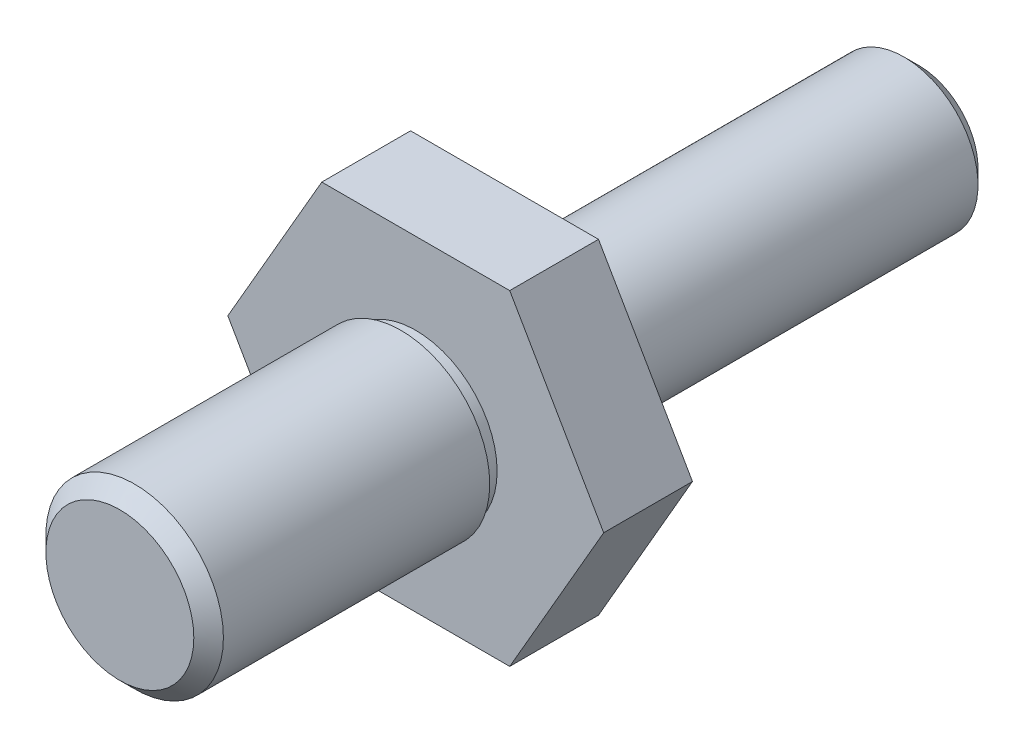
ISO-10303-21;
HEADER;
FILE_DESCRIPTION(('STEP AP214'),'2;1');
FILE_NAME('part.step','',(''),(''),'','','');
FILE_SCHEMA(('AUTOMOTIVE_DESIGN { 1 0 10303 214 1 1 1 1 }'));
ENDSEC;
DATA;
#1=APPLICATION_CONTEXT('core data for automotive mechanical design processes');
#2=APPLICATION_PROTOCOL_DEFINITION('international standard','automotive_design',2000,#1);
#3=PRODUCT_CONTEXT('',#1,'mechanical');
#4=PRODUCT('Part','Part','',(#3));
#5=PRODUCT_RELATED_PRODUCT_CATEGORY('part','',(#4));
#6=PRODUCT_DEFINITION_FORMATION('','',#4);
#7=PRODUCT_DEFINITION_CONTEXT('part definition',#1,'design');
#8=PRODUCT_DEFINITION('design','',#6,#7);
#9=PRODUCT_DEFINITION_SHAPE('','',#8);
#10=(LENGTH_UNIT() NAMED_UNIT(*) SI_UNIT(.MILLI.,.METRE.));
#11=(NAMED_UNIT(*) PLANE_ANGLE_UNIT() SI_UNIT($,.RADIAN.));
#12=(NAMED_UNIT(*) SI_UNIT($,.STERADIAN.) SOLID_ANGLE_UNIT());
#13=UNCERTAINTY_MEASURE_WITH_UNIT(LENGTH_MEASURE(1.E-05),#10,'distance_accuracy_value','');
#14=(GEOMETRIC_REPRESENTATION_CONTEXT(3) GLOBAL_UNCERTAINTY_ASSIGNED_CONTEXT((#13)) GLOBAL_UNIT_ASSIGNED_CONTEXT((#10,
#11,#12)) REPRESENTATION_CONTEXT('',''));
#15=CARTESIAN_POINT('',(0.,0.,0.));
#16=DIRECTION('',(0.,0.,1.));
#17=DIRECTION('',(1.,0.,0.));
#18=AXIS2_PLACEMENT_3D('',#15,#16,#17);
#19=CARTESIAN_POINT('',(0.,0.,-7.5));
#20=DIRECTION('',(0.,0.,-1.));
#21=DIRECTION('',(-1.,0.,0.));
#22=AXIS2_PLACEMENT_3D('',#19,#20,#21);
#23=PLANE('',#22);
#24=CARTESIAN_POINT('',(0.,0.,-7.5));
#25=DIRECTION('',(0.,0.,-1.));
#26=DIRECTION('',(-1.,0.,0.));
#27=AXIS2_PLACEMENT_3D('',#24,#25,#26);
#28=CIRCLE('',#27,7.5);
#29=CARTESIAN_POINT('',(-7.5,0.,-7.5));
#30=VERTEX_POINT('',#29);
#31=EDGE_CURVE('E159',#30,#30,#28,.T.);
#32=ORIENTED_EDGE('',*,*,#31,.T.);
#33=EDGE_LOOP('',(#32));
#34=FACE_BOUND('',#33,.T.);
#35=CARTESIAN_POINT('',(0.,0.,-7.5));
#36=DIRECTION('',(0.,0.,-1.));
#37=DIRECTION('',(-1.,0.,0.));
#38=AXIS2_PLACEMENT_3D('',#35,#36,#37);
#39=CIRCLE('',#38,5.);
#40=CARTESIAN_POINT('',(-5.,0.,-7.5));
#41=VERTEX_POINT('',#40);
#42=EDGE_CURVE('E250',#41,#41,#39,.T.);
#43=ORIENTED_EDGE('',*,*,#42,.F.);
#44=EDGE_LOOP('',(#43));
#45=FACE_BOUND('',#44,.T.);
#46=ADVANCED_FACE('F66',(#34,#45),#23,.T.);
#47=CARTESIAN_POINT('',(-6.35085296108588,11.,-6.));
#48=DIRECTION('',(0.,0.,-1.));
#49=DIRECTION('',(-1.,0.,0.));
#50=AXIS2_PLACEMENT_3D('',#47,#48,#49);
#51=PLANE('',#50);
#52=DIRECTION('',(0.5,0.866025403784438,0.));
#53=VECTOR('',#52,1.);
#54=CARTESIAN_POINT('',(-12.7017059221718,0.,-6.));
#55=LINE('',#54,#53);
#56=CARTESIAN_POINT('',(-12.7017059221718,0.,-6.));
#57=VERTEX_POINT('',#56);
#58=CARTESIAN_POINT('',(-6.35085296108588,11.,-6.));
#59=VERTEX_POINT('',#58);
#60=EDGE_CURVE('E166',#57,#59,#55,.T.);
#61=ORIENTED_EDGE('',*,*,#60,.T.);
#62=DIRECTION('',(1.,0.,0.));
#63=VECTOR('',#62,1.);
#64=CARTESIAN_POINT('',(-6.35085296108588,11.,-6.));
#65=LINE('',#64,#63);
#66=CARTESIAN_POINT('',(6.35085296108588,11.,-6.));
#67=VERTEX_POINT('',#66);
#68=EDGE_CURVE('E122',#59,#67,#65,.T.);
#69=ORIENTED_EDGE('',*,*,#68,.T.);
#70=DIRECTION('',(0.5,-0.866025403784439,0.));
#71=VECTOR('',#70,1.);
#72=CARTESIAN_POINT('',(6.35085296108588,11.,-6.));
#73=LINE('',#72,#71);
#74=CARTESIAN_POINT('',(12.7017059221718,0.,-6.));
#75=VERTEX_POINT('',#74);
#76=EDGE_CURVE('E137',#67,#75,#73,.T.);
#77=ORIENTED_EDGE('',*,*,#76,.T.);
#78=DIRECTION('',(-0.5,-0.866025403784438,0.));
#79=VECTOR('',#78,1.);
#80=CARTESIAN_POINT('',(12.7017059221718,0.,-6.));
#81=LINE('',#80,#79);
#82=CARTESIAN_POINT('',(6.35085296108588,-11.,-6.));
#83=VERTEX_POINT('',#82);
#84=EDGE_CURVE('E130',#75,#83,#81,.T.);
#85=ORIENTED_EDGE('',*,*,#84,.T.);
#86=DIRECTION('',(-1.,0.,0.));
#87=VECTOR('',#86,1.);
#88=CARTESIAN_POINT('',(6.35085296108588,-11.,-6.));
#89=LINE('',#88,#87);
#90=CARTESIAN_POINT('',(-6.35085296108588,-11.,-6.));
#91=VERTEX_POINT('',#90);
#92=EDGE_CURVE('E135',#83,#91,#89,.T.);
#93=ORIENTED_EDGE('',*,*,#92,.T.);
#94=DIRECTION('',(-0.5,0.866025403784438,0.));
#95=VECTOR('',#94,1.);
#96=CARTESIAN_POINT('',(-6.35085296108588,-11.,-6.));
#97=LINE('',#96,#95);
#98=EDGE_CURVE('E83',#91,#57,#97,.T.);
#99=ORIENTED_EDGE('',*,*,#98,.T.);
#100=EDGE_LOOP('',(#61,#69,#77,#85,#93,#99));
#101=FACE_BOUND('',#100,.T.);
#102=CARTESIAN_POINT('',(0.,0.,-6.));
#103=DIRECTION('',(0.,0.,-1.));
#104=DIRECTION('',(-1.,0.,0.));
#105=AXIS2_PLACEMENT_3D('',#102,#103,#104);
#106=CIRCLE('',#105,7.5);
#107=CARTESIAN_POINT('',(-7.5,0.,-6.));
#108=VERTEX_POINT('',#107);
#109=EDGE_CURVE('E254',#108,#108,#106,.T.);
#110=ORIENTED_EDGE('',*,*,#109,.F.);
#111=EDGE_LOOP('',(#110));
#112=FACE_BOUND('',#111,.T.);
#113=ADVANCED_FACE('F132',(#101,#112),#51,.T.);
#114=CARTESIAN_POINT('',(-6.35085296108588,11.,0.));
#115=DIRECTION('',(0.,0.,-1.));
#116=DIRECTION('',(-1.,0.,0.));
#117=AXIS2_PLACEMENT_3D('',#114,#115,#116);
#118=PLANE('',#117);
#119=DIRECTION('',(0.5,0.866025403784438,0.));
#120=VECTOR('',#119,1.);
#121=CARTESIAN_POINT('',(-12.7017059221718,0.,0.));
#122=LINE('',#121,#120);
#123=CARTESIAN_POINT('',(-12.7017059221718,0.,0.));
#124=VERTEX_POINT('',#123);
#125=CARTESIAN_POINT('',(-6.35085296108588,11.,0.));
#126=VERTEX_POINT('',#125);
#127=EDGE_CURVE('E155',#124,#126,#122,.T.);
#128=ORIENTED_EDGE('',*,*,#127,.F.);
#129=DIRECTION('',(-0.5,0.866025403784438,0.));
#130=VECTOR('',#129,1.);
#131=CARTESIAN_POINT('',(-6.35085296108588,-11.,0.));
#132=LINE('',#131,#130);
#133=CARTESIAN_POINT('',(-6.35085296108588,-11.,0.));
#134=VERTEX_POINT('',#133);
#135=EDGE_CURVE('E113',#134,#124,#132,.T.);
#136=ORIENTED_EDGE('',*,*,#135,.F.);
#137=DIRECTION('',(-1.,0.,0.));
#138=VECTOR('',#137,1.);
#139=CARTESIAN_POINT('',(6.35085296108588,-11.,0.));
#140=LINE('',#139,#138);
#141=CARTESIAN_POINT('',(6.35085296108588,-11.,0.));
#142=VERTEX_POINT('',#141);
#143=EDGE_CURVE('E107',#142,#134,#140,.T.);
#144=ORIENTED_EDGE('',*,*,#143,.F.);
#145=DIRECTION('',(-0.5,-0.866025403784438,0.));
#146=VECTOR('',#145,1.);
#147=CARTESIAN_POINT('',(12.7017059221718,0.,0.));
#148=LINE('',#147,#146);
#149=CARTESIAN_POINT('',(12.7017059221718,0.,0.));
#150=VERTEX_POINT('',#149);
#151=EDGE_CURVE('E145',#150,#142,#148,.T.);
#152=ORIENTED_EDGE('',*,*,#151,.F.);
#153=DIRECTION('',(0.5,-0.866025403784439,0.));
#154=VECTOR('',#153,1.);
#155=CARTESIAN_POINT('',(6.35085296108588,11.,0.));
#156=LINE('',#155,#154);
#157=CARTESIAN_POINT('',(6.35085296108588,11.,0.));
#158=VERTEX_POINT('',#157);
#159=EDGE_CURVE('E161',#158,#150,#156,.T.);
#160=ORIENTED_EDGE('',*,*,#159,.F.);
#161=DIRECTION('',(1.,0.,0.));
#162=VECTOR('',#161,1.);
#163=CARTESIAN_POINT('',(-6.35085296108588,11.,0.));
#164=LINE('',#163,#162);
#165=EDGE_CURVE('E158',#126,#158,#164,.T.);
#166=ORIENTED_EDGE('',*,*,#165,.F.);
#167=EDGE_LOOP('',(#128,#136,#144,#152,#160,#166));
#168=FACE_BOUND('',#167,.T.);
#169=CARTESIAN_POINT('',(0.,0.,0.));
#170=DIRECTION('',(0.,0.,1.));
#171=DIRECTION('',(1.,0.,0.));
#172=AXIS2_PLACEMENT_3D('',#169,#170,#171);
#173=CIRCLE('',#172,5.5);
#174=CARTESIAN_POINT('',(5.5,0.,0.));
#175=VERTEX_POINT('',#174);
#176=EDGE_CURVE('E257',#175,#175,#173,.T.);
#177=ORIENTED_EDGE('',*,*,#176,.F.);
#178=EDGE_LOOP('',(#177));
#179=FACE_BOUND('',#178,.T.);
#180=ADVANCED_FACE('F200',(#168,#179),#118,.F.);
#181=CARTESIAN_POINT('',(-12.7017059221718,0.,-6.));
#182=DIRECTION('',(0.866025403784439,-0.5,0.));
#183=DIRECTION('',(0.5,0.866025403784439,0.));
#184=AXIS2_PLACEMENT_3D('',#181,#182,#183);
#185=PLANE('',#184);
#186=ORIENTED_EDGE('',*,*,#127,.T.);
#187=DIRECTION('',(0.,0.,1.));
#188=VECTOR('',#187,1.);
#189=CARTESIAN_POINT('',(-6.35085296108588,11.,-6.));
#190=LINE('',#189,#188);
#191=EDGE_CURVE('E173',#59,#126,#190,.T.);
#192=ORIENTED_EDGE('',*,*,#191,.F.);
#193=ORIENTED_EDGE('',*,*,#60,.F.);
#194=DIRECTION('',(0.,0.,1.));
#195=VECTOR('',#194,1.);
#196=CARTESIAN_POINT('',(-12.7017059221718,0.,-6.));
#197=LINE('',#196,#195);
#198=EDGE_CURVE('E151',#57,#124,#197,.T.);
#199=ORIENTED_EDGE('',*,*,#198,.T.);
#200=EDGE_LOOP('',(#186,#192,#193,#199));
#201=FACE_BOUND('',#200,.T.);
#202=ADVANCED_FACE('F215',(#201),#185,.F.);
#203=CARTESIAN_POINT('',(-6.35085296108588,11.,-6.));
#204=DIRECTION('',(0.,-1.,0.));
#205=DIRECTION('',(1.,0.,0.));
#206=AXIS2_PLACEMENT_3D('',#203,#204,#205);
#207=PLANE('',#206);
#208=ORIENTED_EDGE('',*,*,#165,.T.);
#209=DIRECTION('',(0.,0.,1.));
#210=VECTOR('',#209,1.);
#211=CARTESIAN_POINT('',(6.35085296108588,11.,-6.));
#212=LINE('',#211,#210);
#213=EDGE_CURVE('E170',#67,#158,#212,.T.);
#214=ORIENTED_EDGE('',*,*,#213,.F.);
#215=ORIENTED_EDGE('',*,*,#68,.F.);
#216=ORIENTED_EDGE('',*,*,#191,.T.);
#217=EDGE_LOOP('',(#208,#214,#215,#216));
#218=FACE_BOUND('',#217,.T.);
#219=ADVANCED_FACE('F226',(#218),#207,.F.);
#220=CARTESIAN_POINT('',(6.35085296108588,11.,-6.));
#221=DIRECTION('',(-0.866025403784438,-0.5,0.));
#222=DIRECTION('',(0.5,-0.866025403784439,0.));
#223=AXIS2_PLACEMENT_3D('',#220,#221,#222);
#224=PLANE('',#223);
#225=ORIENTED_EDGE('',*,*,#159,.T.);
#226=DIRECTION('',(0.,0.,1.));
#227=VECTOR('',#226,1.);
#228=CARTESIAN_POINT('',(12.7017059221718,0.,-6.));
#229=LINE('',#228,#227);
#230=EDGE_CURVE('E146',#75,#150,#229,.T.);
#231=ORIENTED_EDGE('',*,*,#230,.F.);
#232=ORIENTED_EDGE('',*,*,#76,.F.);
#233=ORIENTED_EDGE('',*,*,#213,.T.);
#234=EDGE_LOOP('',(#225,#231,#232,#233));
#235=FACE_BOUND('',#234,.T.);
#236=ADVANCED_FACE('F223',(#235),#224,.F.);
#237=CARTESIAN_POINT('',(12.7017059221718,0.,-6.));
#238=DIRECTION('',(-0.866025403784439,0.5,0.));
#239=DIRECTION('',(-0.5,-0.866025403784439,0.));
#240=AXIS2_PLACEMENT_3D('',#237,#238,#239);
#241=PLANE('',#240);
#242=ORIENTED_EDGE('',*,*,#151,.T.);
#243=DIRECTION('',(0.,0.,1.));
#244=VECTOR('',#243,1.);
#245=CARTESIAN_POINT('',(6.35085296108588,-11.,-6.));
#246=LINE('',#245,#244);
#247=EDGE_CURVE('E142',#83,#142,#246,.T.);
#248=ORIENTED_EDGE('',*,*,#247,.F.);
#249=ORIENTED_EDGE('',*,*,#84,.F.);
#250=ORIENTED_EDGE('',*,*,#230,.T.);
#251=EDGE_LOOP('',(#242,#248,#249,#250));
#252=FACE_BOUND('',#251,.T.);
#253=ADVANCED_FACE('F143',(#252),#241,.F.);
#254=CARTESIAN_POINT('',(6.35085296108588,-11.,-6.));
#255=DIRECTION('',(0.,1.,0.));
#256=DIRECTION('',(0.,0.,1.));
#257=AXIS2_PLACEMENT_3D('',#254,#255,#256);
#258=PLANE('',#257);
#259=ORIENTED_EDGE('',*,*,#143,.T.);
#260=DIRECTION('',(0.,0.,1.));
#261=VECTOR('',#260,1.);
#262=CARTESIAN_POINT('',(-6.35085296108588,-11.,-6.));
#263=LINE('',#262,#261);
#264=EDGE_CURVE('E147',#91,#134,#263,.T.);
#265=ORIENTED_EDGE('',*,*,#264,.F.);
#266=ORIENTED_EDGE('',*,*,#92,.F.);
#267=ORIENTED_EDGE('',*,*,#247,.T.);
#268=EDGE_LOOP('',(#259,#265,#266,#267));
#269=FACE_BOUND('',#268,.T.);
#270=ADVANCED_FACE('F149',(#269),#258,.F.);
#271=CARTESIAN_POINT('',(-6.35085296108588,-11.,-6.));
#272=DIRECTION('',(0.866025403784438,0.5,0.));
#273=DIRECTION('',(-0.5,0.866025403784438,0.));
#274=AXIS2_PLACEMENT_3D('',#271,#272,#273);
#275=PLANE('',#274);
#276=ORIENTED_EDGE('',*,*,#135,.T.);
#277=ORIENTED_EDGE('',*,*,#198,.F.);
#278=ORIENTED_EDGE('',*,*,#98,.F.);
#279=ORIENTED_EDGE('',*,*,#264,.T.);
#280=EDGE_LOOP('',(#276,#277,#278,#279));
#281=FACE_BOUND('',#280,.T.);
#282=ADVANCED_FACE('F210',(#281),#275,.F.);
#283=CARTESIAN_POINT('',(0.,0.,-7.5));
#284=DIRECTION('',(0.,0.,1.));
#285=DIRECTION('',(1.,0.,0.));
#286=AXIS2_PLACEMENT_3D('',#283,#284,#285);
#287=CYLINDRICAL_SURFACE('',#286,7.5);
#288=ORIENTED_EDGE('',*,*,#31,.F.);
#289=EDGE_LOOP('',(#288));
#290=FACE_BOUND('',#289,.T.);
#291=ORIENTED_EDGE('',*,*,#109,.T.);
#292=EDGE_LOOP('',(#291));
#293=FACE_BOUND('',#292,.T.);
#294=ADVANCED_FACE('F208',(#290,#293),#287,.T.);
#295=CARTESIAN_POINT('',(0.,0.,-34.));
#296=DIRECTION('',(0.,0.,1.));
#297=DIRECTION('',(1.,0.,0.));
#298=AXIS2_PLACEMENT_3D('',#295,#296,#297);
#299=CYLINDRICAL_SURFACE('',#298,5.);
#300=CARTESIAN_POINT('',(0.,0.,-33.));
#301=DIRECTION('',(0.,0.,-1.));
#302=DIRECTION('',(-1.,0.,0.));
#303=AXIS2_PLACEMENT_3D('',#300,#301,#302);
#304=CIRCLE('',#303,5.);
#305=CARTESIAN_POINT('',(-5.,0.,-33.));
#306=VERTEX_POINT('',#305);
#307=EDGE_CURVE('E178',#306,#306,#304,.F.);
#308=ORIENTED_EDGE('',*,*,#307,.T.);
#309=EDGE_LOOP('',(#308));
#310=FACE_BOUND('',#309,.T.);
#311=ORIENTED_EDGE('',*,*,#42,.T.);
#312=EDGE_LOOP('',(#311));
#313=FACE_BOUND('',#312,.T.);
#314=ADVANCED_FACE('F206',(#310,#313),#299,.T.);
#315=CARTESIAN_POINT('',(0.,0.,-34.));
#316=DIRECTION('',(0.,0.,-1.));
#317=DIRECTION('',(-1.,0.,0.));
#318=AXIS2_PLACEMENT_3D('',#315,#316,#317);
#319=PLANE('',#318);
#320=CARTESIAN_POINT('',(0.,0.,-34.));
#321=DIRECTION('',(0.,0.,-1.));
#322=DIRECTION('',(-1.,0.,0.));
#323=AXIS2_PLACEMENT_3D('',#320,#321,#322);
#324=CIRCLE('',#323,4.);
#325=CARTESIAN_POINT('',(-4.,0.,-34.));
#326=VERTEX_POINT('',#325);
#327=EDGE_CURVE('E175',#326,#326,#324,.T.);
#328=ORIENTED_EDGE('',*,*,#327,.T.);
#329=EDGE_LOOP('',(#328));
#330=FACE_BOUND('',#329,.T.);
#331=CARTESIAN_POINT('',(0.,0.,-34.));
#332=DIRECTION('',(0.,0.,-1.));
#333=DIRECTION('',(-1.,0.,0.));
#334=AXIS2_PLACEMENT_3D('',#331,#332,#333);
#335=CIRCLE('',#334,2.1);
#336=CARTESIAN_POINT('',(-2.1,0.,-34.));
#337=VERTEX_POINT('',#336);
#338=EDGE_CURVE('E275',#337,#337,#335,.T.);
#339=ORIENTED_EDGE('',*,*,#338,.F.);
#340=EDGE_LOOP('',(#339));
#341=FACE_BOUND('',#340,.T.);
#342=ADVANCED_FACE('F284',(#330,#341),#319,.T.);
#343=CARTESIAN_POINT('',(0.,0.,1.));
#344=DIRECTION('',(0.,0.,1.));
#345=DIRECTION('',(1.,0.,0.));
#346=AXIS2_PLACEMENT_3D('',#343,#344,#345);
#347=PLANE('',#346);
#348=CARTESIAN_POINT('',(0.,0.,1.));
#349=DIRECTION('',(0.,0.,1.));
#350=DIRECTION('',(1.,0.,0.));
#351=AXIS2_PLACEMENT_3D('',#348,#349,#350);
#352=CIRCLE('',#351,6.);
#353=CARTESIAN_POINT('',(6.,0.,1.));
#354=VERTEX_POINT('',#353);
#355=EDGE_CURVE('E248',#354,#354,#352,.T.);
#356=ORIENTED_EDGE('',*,*,#355,.F.);
#357=EDGE_LOOP('',(#356));
#358=FACE_BOUND('',#357,.T.);
#359=CARTESIAN_POINT('',(0.,0.,1.));
#360=DIRECTION('',(0.,0.,1.));
#361=DIRECTION('',(1.,0.,0.));
#362=AXIS2_PLACEMENT_3D('',#359,#360,#361);
#363=CIRCLE('',#362,5.5);
#364=CARTESIAN_POINT('',(5.5,0.,1.));
#365=VERTEX_POINT('',#364);
#366=EDGE_CURVE('E251',#365,#365,#363,.T.);
#367=ORIENTED_EDGE('',*,*,#366,.T.);
#368=EDGE_LOOP('',(#367));
#369=FACE_BOUND('',#368,.T.);
#370=ADVANCED_FACE('F286',(#358,#369),#347,.F.);
#371=CARTESIAN_POINT('',(0.,0.,1.));
#372=DIRECTION('',(0.,0.,-1.));
#373=DIRECTION('',(-1.,0.,0.));
#374=AXIS2_PLACEMENT_3D('',#371,#372,#373);
#375=CYLINDRICAL_SURFACE('',#374,5.5);
#376=ORIENTED_EDGE('',*,*,#366,.F.);
#377=EDGE_LOOP('',(#376));
#378=FACE_BOUND('',#377,.T.);
#379=ORIENTED_EDGE('',*,*,#176,.T.);
#380=EDGE_LOOP('',(#379));
#381=FACE_BOUND('',#380,.T.);
#382=ADVANCED_FACE('F236',(#378,#381),#375,.T.);
#383=CARTESIAN_POINT('',(0.,0.,20.));
#384=DIRECTION('',(0.,0.,1.));
#385=DIRECTION('',(1.,0.,0.));
#386=AXIS2_PLACEMENT_3D('',#383,#384,#385);
#387=PLANE('',#386);
#388=CARTESIAN_POINT('',(0.,0.,20.));
#389=DIRECTION('',(0.,0.,1.));
#390=DIRECTION('',(1.,0.,0.));
#391=AXIS2_PLACEMENT_3D('',#388,#389,#390);
#392=CIRCLE('',#391,4.99999999999999);
#393=CARTESIAN_POINT('',(4.99999999999999,0.,20.));
#394=VERTEX_POINT('',#393);
#395=EDGE_CURVE('E75',#394,#394,#392,.T.);
#396=ORIENTED_EDGE('',*,*,#395,.T.);
#397=EDGE_LOOP('',(#396));
#398=FACE_BOUND('',#397,.T.);
#399=ADVANCED_FACE('F183',(#398),#387,.T.);
#400=CARTESIAN_POINT('',(0.,0.,20.));
#401=DIRECTION('',(0.,0.,-1.));
#402=DIRECTION('',(-1.,0.,0.));
#403=AXIS2_PLACEMENT_3D('',#400,#401,#402);
#404=CYLINDRICAL_SURFACE('',#403,6.);
#405=CARTESIAN_POINT('',(0.,0.,19.));
#406=DIRECTION('',(0.,0.,1.));
#407=DIRECTION('',(1.,0.,0.));
#408=AXIS2_PLACEMENT_3D('',#405,#406,#407);
#409=CIRCLE('',#408,6.);
#410=CARTESIAN_POINT('',(6.,0.,19.));
#411=VERTEX_POINT('',#410);
#412=EDGE_CURVE('E12',#411,#411,#409,.F.);
#413=ORIENTED_EDGE('',*,*,#412,.T.);
#414=EDGE_LOOP('',(#413));
#415=FACE_BOUND('',#414,.T.);
#416=ORIENTED_EDGE('',*,*,#355,.T.);
#417=EDGE_LOOP('',(#416));
#418=FACE_BOUND('',#417,.T.);
#419=ADVANCED_FACE('F235',(#415,#418),#404,.T.);
#420=CARTESIAN_POINT('',(0.,0.,-21.6));
#421=DIRECTION('',(0.,0.,-1.));
#422=DIRECTION('',(-1.,0.,0.));
#423=AXIS2_PLACEMENT_3D('',#420,#421,#422);
#424=CONICAL_SURFACE('',#423,2.1,1.02974425867665);
#425=CARTESIAN_POINT('',(0.,0.,-20.3381927000421));
#426=VERTEX_POINT('',#425);
#427=VERTEX_LOOP('',#426);
#428=FACE_BOUND('',#427,.T.);
#429=CARTESIAN_POINT('',(0.,0.,-21.6));
#430=DIRECTION('',(0.,0.,-1.));
#431=DIRECTION('',(-1.,0.,0.));
#432=AXIS2_PLACEMENT_3D('',#429,#430,#431);
#433=CIRCLE('',#432,2.1);
#434=CARTESIAN_POINT('',(-2.1,0.,-21.6));
#435=VERTEX_POINT('',#434);
#436=EDGE_CURVE('E273',#435,#435,#433,.T.);
#437=ORIENTED_EDGE('',*,*,#436,.T.);
#438=EDGE_LOOP('',(#437));
#439=FACE_BOUND('',#438,.T.);
#440=ADVANCED_FACE('F238',(#428,#439),#424,.F.);
#441=CARTESIAN_POINT('',(0.,0.,-34.));
#442=DIRECTION('',(0.,0.,-1.));
#443=DIRECTION('',(-1.,0.,0.));
#444=AXIS2_PLACEMENT_3D('',#441,#442,#443);
#445=CYLINDRICAL_SURFACE('',#444,2.1);
#446=ORIENTED_EDGE('',*,*,#436,.F.);
#447=EDGE_LOOP('',(#446));
#448=FACE_BOUND('',#447,.T.);
#449=ORIENTED_EDGE('',*,*,#338,.T.);
#450=EDGE_LOOP('',(#449));
#451=FACE_BOUND('',#450,.T.);
#452=ADVANCED_FACE('F191',(#448,#451),#445,.F.);
#453=CARTESIAN_POINT('',(0.,0.,-34.));
#454=DIRECTION('',(0.,0.,1.));
#455=DIRECTION('',(1.,0.,0.));
#456=AXIS2_PLACEMENT_3D('',#453,#454,#455);
#457=CONICAL_SURFACE('',#456,4.,0.785398163397446);
#458=ORIENTED_EDGE('',*,*,#307,.F.);
#459=EDGE_LOOP('',(#458));
#460=FACE_BOUND('',#459,.T.);
#461=ORIENTED_EDGE('',*,*,#327,.F.);
#462=EDGE_LOOP('',(#461));
#463=FACE_BOUND('',#462,.T.);
#464=ADVANCED_FACE('F186',(#460,#463),#457,.T.);
#465=CARTESIAN_POINT('',(0.,0.,20.));
#466=DIRECTION('',(0.,0.,-1.));
#467=DIRECTION('',(-1.,0.,0.));
#468=AXIS2_PLACEMENT_3D('',#465,#466,#467);
#469=CONICAL_SURFACE('',#468,4.99999999999999,0.785398163397445);
#470=ORIENTED_EDGE('',*,*,#412,.F.);
#471=EDGE_LOOP('',(#470));
#472=FACE_BOUND('',#471,.T.);
#473=ORIENTED_EDGE('',*,*,#395,.F.);
#474=EDGE_LOOP('',(#473));
#475=FACE_BOUND('',#474,.T.);
#476=ADVANCED_FACE('F68',(#472,#475),#469,.T.);
#477=CLOSED_SHELL('',(#46,#113,#180,#202,#219,#236,#253,#270,#282,#294,#314,#342,#370,#382,#399,
#419,#440,#452,#464,#476));
#478=MANIFOLD_SOLID_BREP('B2',#477);
#479=ADVANCED_BREP_SHAPE_REPRESENTATION('',(#18,#478),#14);
#480=SHAPE_DEFINITION_REPRESENTATION(#9,#479);
ENDSEC;
END-ISO-10303-21;
